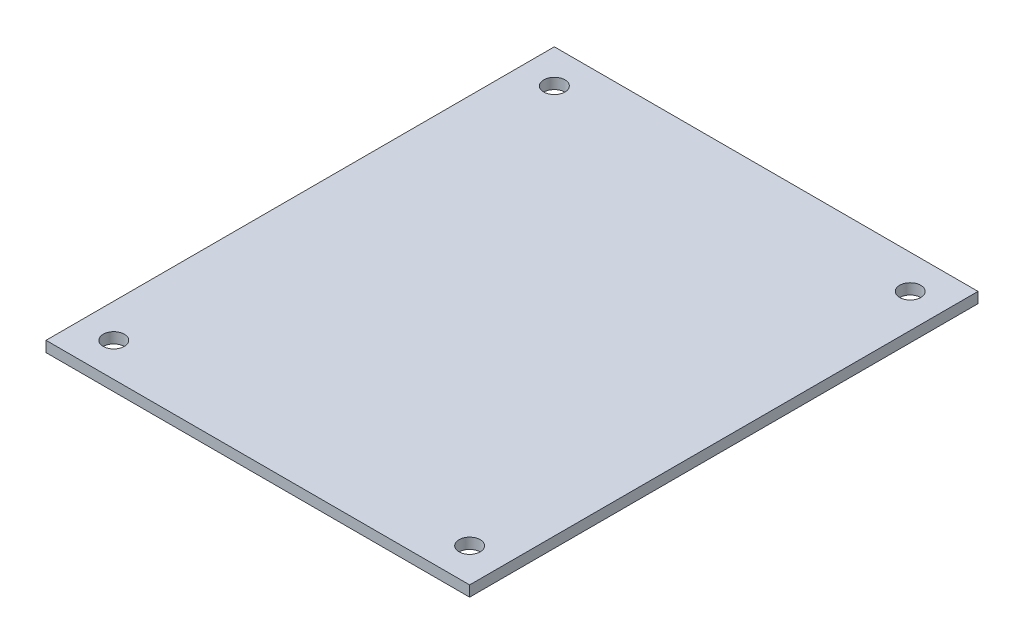
ISO-10303-21;
HEADER;
FILE_DESCRIPTION(('STEP AP214'),'2;1');
FILE_NAME('part.step','',(''),(''),'','','');
FILE_SCHEMA(('AUTOMOTIVE_DESIGN { 1 0 10303 214 1 1 1 1 }'));
ENDSEC;
DATA;
#1=APPLICATION_CONTEXT('core data for automotive mechanical design processes');
#2=APPLICATION_PROTOCOL_DEFINITION('international standard','automotive_design',2000,#1);
#3=PRODUCT_CONTEXT('',#1,'mechanical');
#4=PRODUCT('Part','Part','',(#3));
#5=PRODUCT_RELATED_PRODUCT_CATEGORY('part','',(#4));
#6=PRODUCT_DEFINITION_FORMATION('','',#4);
#7=PRODUCT_DEFINITION_CONTEXT('part definition',#1,'design');
#8=PRODUCT_DEFINITION('design','',#6,#7);
#9=PRODUCT_DEFINITION_SHAPE('','',#8);
#10=(LENGTH_UNIT() NAMED_UNIT(*) SI_UNIT(.MILLI.,.METRE.));
#11=(NAMED_UNIT(*) PLANE_ANGLE_UNIT() SI_UNIT($,.RADIAN.));
#12=(NAMED_UNIT(*) SI_UNIT($,.STERADIAN.) SOLID_ANGLE_UNIT());
#13=UNCERTAINTY_MEASURE_WITH_UNIT(LENGTH_MEASURE(1.E-05),#10,'distance_accuracy_value','');
#14=(GEOMETRIC_REPRESENTATION_CONTEXT(3) GLOBAL_UNCERTAINTY_ASSIGNED_CONTEXT((#13)) GLOBAL_UNIT_ASSIGNED_CONTEXT((#10,
#11,#12)) REPRESENTATION_CONTEXT('',''));
#15=CARTESIAN_POINT('',(0.,0.,0.));
#16=DIRECTION('',(0.,0.,1.));
#17=DIRECTION('',(1.,0.,0.));
#18=AXIS2_PLACEMENT_3D('',#15,#16,#17);
#19=CARTESIAN_POINT('',(0.,1.6,0.));
#20=DIRECTION('',(0.,-1.,0.));
#21=DIRECTION('',(0.,0.,-1.));
#22=AXIS2_PLACEMENT_3D('',#19,#20,#21);
#23=PLANE('',#22);
#24=CARTESIAN_POINT('',(58.42,1.6,-71.12));
#25=DIRECTION('',(0.,1.,0.));
#26=DIRECTION('',(0.,0.,1.));
#27=AXIS2_PLACEMENT_3D('',#24,#25,#26);
#28=CIRCLE('',#27,1.5875);
#29=CARTESIAN_POINT('',(58.42,1.6,-69.5325));
#30=VERTEX_POINT('',#29);
#31=EDGE_CURVE('E123',#30,#30,#28,.T.);
#32=ORIENTED_EDGE('',*,*,#31,.F.);
#33=EDGE_LOOP('',(#32));
#34=FACE_BOUND('',#33,.T.);
#35=CARTESIAN_POINT('',(5.08,1.6,-5.08));
#36=DIRECTION('',(0.,1.,0.));
#37=DIRECTION('',(0.,0.,1.));
#38=AXIS2_PLACEMENT_3D('',#35,#36,#37);
#39=CIRCLE('',#38,1.5875);
#40=CARTESIAN_POINT('',(5.08,1.6,-3.4925));
#41=VERTEX_POINT('',#40);
#42=EDGE_CURVE('E102',#41,#41,#39,.T.);
#43=ORIENTED_EDGE('',*,*,#42,.F.);
#44=EDGE_LOOP('',(#43));
#45=FACE_BOUND('',#44,.T.);
#46=DIRECTION('',(0.,0.,1.));
#47=VECTOR('',#46,1.);
#48=CARTESIAN_POINT('',(0.,1.6,0.));
#49=LINE('',#48,#47);
#50=CARTESIAN_POINT('',(0.,1.6,-76.2));
#51=VERTEX_POINT('',#50);
#52=CARTESIAN_POINT('',(0.,1.6,0.));
#53=VERTEX_POINT('',#52);
#54=EDGE_CURVE('E87',#51,#53,#49,.T.);
#55=ORIENTED_EDGE('',*,*,#54,.T.);
#56=DIRECTION('',(1.,0.,0.));
#57=VECTOR('',#56,1.);
#58=CARTESIAN_POINT('',(0.,1.6,0.));
#59=LINE('',#58,#57);
#60=CARTESIAN_POINT('',(63.5,1.6,0.));
#61=VERTEX_POINT('',#60);
#62=EDGE_CURVE('E82',#53,#61,#59,.T.);
#63=ORIENTED_EDGE('',*,*,#62,.T.);
#64=DIRECTION('',(0.,0.,-1.));
#65=VECTOR('',#64,1.);
#66=CARTESIAN_POINT('',(63.5,1.6,0.));
#67=LINE('',#66,#65);
#68=CARTESIAN_POINT('',(63.5,1.6,-76.2));
#69=VERTEX_POINT('',#68);
#70=EDGE_CURVE('E85',#61,#69,#67,.T.);
#71=ORIENTED_EDGE('',*,*,#70,.T.);
#72=DIRECTION('',(-1.,0.,0.));
#73=VECTOR('',#72,1.);
#74=CARTESIAN_POINT('',(0.,1.6,-76.2));
#75=LINE('',#74,#73);
#76=EDGE_CURVE('E52',#69,#51,#75,.T.);
#77=ORIENTED_EDGE('',*,*,#76,.T.);
#78=EDGE_LOOP('',(#55,#63,#71,#77));
#79=FACE_BOUND('',#78,.T.);
#80=CARTESIAN_POINT('',(58.42,1.6,-5.08));
#81=DIRECTION('',(0.,1.,0.));
#82=DIRECTION('',(0.,0.,1.));
#83=AXIS2_PLACEMENT_3D('',#80,#81,#82);
#84=CIRCLE('',#83,1.5875);
#85=CARTESIAN_POINT('',(58.42,1.6,-3.4925));
#86=VERTEX_POINT('',#85);
#87=EDGE_CURVE('E117',#86,#86,#84,.T.);
#88=ORIENTED_EDGE('',*,*,#87,.F.);
#89=EDGE_LOOP('',(#88));
#90=FACE_BOUND('',#89,.T.);
#91=CARTESIAN_POINT('',(5.08,1.6,-71.12));
#92=DIRECTION('',(0.,1.,0.));
#93=DIRECTION('',(0.,0.,1.));
#94=AXIS2_PLACEMENT_3D('',#91,#92,#93);
#95=CIRCLE('',#94,1.5875);
#96=CARTESIAN_POINT('',(5.08,1.6,-69.5325));
#97=VERTEX_POINT('',#96);
#98=EDGE_CURVE('E129',#97,#97,#95,.T.);
#99=ORIENTED_EDGE('',*,*,#98,.F.);
#100=EDGE_LOOP('',(#99));
#101=FACE_BOUND('',#100,.T.);
#102=ADVANCED_FACE('F35',(#34,#45,#79,#90,#101),#23,.F.);
#103=CARTESIAN_POINT('',(0.,0.,0.));
#104=DIRECTION('',(0.,-1.,0.));
#105=DIRECTION('',(0.,0.,-1.));
#106=AXIS2_PLACEMENT_3D('',#103,#104,#105);
#107=PLANE('',#106);
#108=CARTESIAN_POINT('',(58.42,0.,-71.12));
#109=DIRECTION('',(0.,1.,0.));
#110=DIRECTION('',(0.,0.,1.));
#111=AXIS2_PLACEMENT_3D('',#108,#109,#110);
#112=CIRCLE('',#111,1.5875);
#113=CARTESIAN_POINT('',(58.42,0.,-69.5325));
#114=VERTEX_POINT('',#113);
#115=EDGE_CURVE('E126',#114,#114,#112,.T.);
#116=ORIENTED_EDGE('',*,*,#115,.T.);
#117=EDGE_LOOP('',(#116));
#118=FACE_BOUND('',#117,.T.);
#119=CARTESIAN_POINT('',(5.08,0.,-5.08));
#120=DIRECTION('',(0.,1.,0.));
#121=DIRECTION('',(0.,0.,1.));
#122=AXIS2_PLACEMENT_3D('',#119,#120,#121);
#123=CIRCLE('',#122,1.5875);
#124=CARTESIAN_POINT('',(5.08,0.,-3.4925));
#125=VERTEX_POINT('',#124);
#126=EDGE_CURVE('E114',#125,#125,#123,.T.);
#127=ORIENTED_EDGE('',*,*,#126,.T.);
#128=EDGE_LOOP('',(#127));
#129=FACE_BOUND('',#128,.T.);
#130=DIRECTION('',(0.,0.,1.));
#131=VECTOR('',#130,1.);
#132=CARTESIAN_POINT('',(0.,0.,0.));
#133=LINE('',#132,#131);
#134=CARTESIAN_POINT('',(0.,0.,-76.2));
#135=VERTEX_POINT('',#134);
#136=CARTESIAN_POINT('',(0.,0.,0.));
#137=VERTEX_POINT('',#136);
#138=EDGE_CURVE('E99',#135,#137,#133,.T.);
#139=ORIENTED_EDGE('',*,*,#138,.F.);
#140=DIRECTION('',(-1.,0.,0.));
#141=VECTOR('',#140,1.);
#142=CARTESIAN_POINT('',(0.,0.,-76.2));
#143=LINE('',#142,#141);
#144=CARTESIAN_POINT('',(63.5,0.,-76.2));
#145=VERTEX_POINT('',#144);
#146=EDGE_CURVE('E75',#145,#135,#143,.T.);
#147=ORIENTED_EDGE('',*,*,#146,.F.);
#148=DIRECTION('',(0.,0.,-1.));
#149=VECTOR('',#148,1.);
#150=CARTESIAN_POINT('',(63.5,0.,0.));
#151=LINE('',#150,#149);
#152=CARTESIAN_POINT('',(63.5,0.,0.));
#153=VERTEX_POINT('',#152);
#154=EDGE_CURVE('E69',#153,#145,#151,.T.);
#155=ORIENTED_EDGE('',*,*,#154,.F.);
#156=DIRECTION('',(1.,0.,0.));
#157=VECTOR('',#156,1.);
#158=CARTESIAN_POINT('',(0.,0.,0.));
#159=LINE('',#158,#157);
#160=EDGE_CURVE('E91',#137,#153,#159,.T.);
#161=ORIENTED_EDGE('',*,*,#160,.F.);
#162=EDGE_LOOP('',(#139,#147,#155,#161));
#163=FACE_BOUND('',#162,.T.);
#164=CARTESIAN_POINT('',(58.42,0.,-5.08));
#165=DIRECTION('',(0.,1.,0.));
#166=DIRECTION('',(0.,0.,1.));
#167=AXIS2_PLACEMENT_3D('',#164,#165,#166);
#168=CIRCLE('',#167,1.5875);
#169=CARTESIAN_POINT('',(58.42,0.,-3.4925));
#170=VERTEX_POINT('',#169);
#171=EDGE_CURVE('E120',#170,#170,#168,.T.);
#172=ORIENTED_EDGE('',*,*,#171,.T.);
#173=EDGE_LOOP('',(#172));
#174=FACE_BOUND('',#173,.T.);
#175=CARTESIAN_POINT('',(5.08,0.,-71.12));
#176=DIRECTION('',(0.,1.,0.));
#177=DIRECTION('',(0.,0.,1.));
#178=AXIS2_PLACEMENT_3D('',#175,#176,#177);
#179=CIRCLE('',#178,1.5875);
#180=CARTESIAN_POINT('',(5.08,0.,-69.5325));
#181=VERTEX_POINT('',#180);
#182=EDGE_CURVE('E132',#181,#181,#179,.T.);
#183=ORIENTED_EDGE('',*,*,#182,.T.);
#184=EDGE_LOOP('',(#183));
#185=FACE_BOUND('',#184,.T.);
#186=ADVANCED_FACE('F110',(#118,#129,#163,#174,#185),#107,.T.);
#187=CARTESIAN_POINT('',(0.,1.6,0.));
#188=DIRECTION('',(1.,0.,0.));
#189=DIRECTION('',(0.,0.,-1.));
#190=AXIS2_PLACEMENT_3D('',#187,#188,#189);
#191=PLANE('',#190);
#192=ORIENTED_EDGE('',*,*,#138,.T.);
#193=DIRECTION('',(0.,-1.,0.));
#194=VECTOR('',#193,1.);
#195=CARTESIAN_POINT('',(0.,1.6,0.));
#196=LINE('',#195,#194);
#197=EDGE_CURVE('E11',#53,#137,#196,.T.);
#198=ORIENTED_EDGE('',*,*,#197,.F.);
#199=ORIENTED_EDGE('',*,*,#54,.F.);
#200=DIRECTION('',(0.,-1.,0.));
#201=VECTOR('',#200,1.);
#202=CARTESIAN_POINT('',(0.,1.6,-76.2));
#203=LINE('',#202,#201);
#204=EDGE_CURVE('E95',#51,#135,#203,.T.);
#205=ORIENTED_EDGE('',*,*,#204,.T.);
#206=EDGE_LOOP('',(#192,#198,#199,#205));
#207=FACE_BOUND('',#206,.T.);
#208=ADVANCED_FACE('F37',(#207),#191,.F.);
#209=CARTESIAN_POINT('',(0.,1.6,0.));
#210=DIRECTION('',(0.,0.,-1.));
#211=DIRECTION('',(-1.,0.,0.));
#212=AXIS2_PLACEMENT_3D('',#209,#210,#211);
#213=PLANE('',#212);
#214=ORIENTED_EDGE('',*,*,#160,.T.);
#215=DIRECTION('',(0.,-1.,0.));
#216=VECTOR('',#215,1.);
#217=CARTESIAN_POINT('',(63.5,1.6,0.));
#218=LINE('',#217,#216);
#219=EDGE_CURVE('E44',#61,#153,#218,.T.);
#220=ORIENTED_EDGE('',*,*,#219,.F.);
#221=ORIENTED_EDGE('',*,*,#62,.F.);
#222=ORIENTED_EDGE('',*,*,#197,.T.);
#223=EDGE_LOOP('',(#214,#220,#221,#222));
#224=FACE_BOUND('',#223,.T.);
#225=ADVANCED_FACE('F90',(#224),#213,.F.);
#226=CARTESIAN_POINT('',(63.5,1.6,0.));
#227=DIRECTION('',(-1.,0.,0.));
#228=DIRECTION('',(0.,0.,1.));
#229=AXIS2_PLACEMENT_3D('',#226,#227,#228);
#230=PLANE('',#229);
#231=ORIENTED_EDGE('',*,*,#154,.T.);
#232=DIRECTION('',(0.,-1.,0.));
#233=VECTOR('',#232,1.);
#234=CARTESIAN_POINT('',(63.5,1.6,-76.2));
#235=LINE('',#234,#233);
#236=EDGE_CURVE('E92',#69,#145,#235,.T.);
#237=ORIENTED_EDGE('',*,*,#236,.F.);
#238=ORIENTED_EDGE('',*,*,#70,.F.);
#239=ORIENTED_EDGE('',*,*,#219,.T.);
#240=EDGE_LOOP('',(#231,#237,#238,#239));
#241=FACE_BOUND('',#240,.T.);
#242=ADVANCED_FACE('F93',(#241),#230,.F.);
#243=CARTESIAN_POINT('',(0.,1.6,-76.2));
#244=DIRECTION('',(0.,0.,1.));
#245=DIRECTION('',(1.,0.,0.));
#246=AXIS2_PLACEMENT_3D('',#243,#244,#245);
#247=PLANE('',#246);
#248=ORIENTED_EDGE('',*,*,#146,.T.);
#249=ORIENTED_EDGE('',*,*,#204,.F.);
#250=ORIENTED_EDGE('',*,*,#76,.F.);
#251=ORIENTED_EDGE('',*,*,#236,.T.);
#252=EDGE_LOOP('',(#248,#249,#250,#251));
#253=FACE_BOUND('',#252,.T.);
#254=ADVANCED_FACE('F107',(#253),#247,.F.);
#255=CARTESIAN_POINT('',(5.08,1.6,-5.08));
#256=DIRECTION('',(0.,-1.,0.));
#257=DIRECTION('',(0.,0.,-1.));
#258=AXIS2_PLACEMENT_3D('',#255,#256,#257);
#259=CYLINDRICAL_SURFACE('',#258,1.5875);
#260=ORIENTED_EDGE('',*,*,#42,.T.);
#261=EDGE_LOOP('',(#260));
#262=FACE_BOUND('',#261,.T.);
#263=ORIENTED_EDGE('',*,*,#126,.F.);
#264=EDGE_LOOP('',(#263));
#265=FACE_BOUND('',#264,.T.);
#266=ADVANCED_FACE('F152',(#262,#265),#259,.F.);
#267=CARTESIAN_POINT('',(58.42,1.6,-5.08));
#268=DIRECTION('',(0.,-1.,0.));
#269=DIRECTION('',(0.,0.,-1.));
#270=AXIS2_PLACEMENT_3D('',#267,#268,#269);
#271=CYLINDRICAL_SURFACE('',#270,1.5875);
#272=ORIENTED_EDGE('',*,*,#87,.T.);
#273=EDGE_LOOP('',(#272));
#274=FACE_BOUND('',#273,.T.);
#275=ORIENTED_EDGE('',*,*,#171,.F.);
#276=EDGE_LOOP('',(#275));
#277=FACE_BOUND('',#276,.T.);
#278=ADVANCED_FACE('F200',(#274,#277),#271,.F.);
#279=CARTESIAN_POINT('',(58.42,1.6,-71.12));
#280=DIRECTION('',(0.,-1.,0.));
#281=DIRECTION('',(0.,0.,-1.));
#282=AXIS2_PLACEMENT_3D('',#279,#280,#281);
#283=CYLINDRICAL_SURFACE('',#282,1.5875);
#284=ORIENTED_EDGE('',*,*,#31,.T.);
#285=EDGE_LOOP('',(#284));
#286=FACE_BOUND('',#285,.T.);
#287=ORIENTED_EDGE('',*,*,#115,.F.);
#288=EDGE_LOOP('',(#287));
#289=FACE_BOUND('',#288,.T.);
#290=ADVANCED_FACE('F208',(#286,#289),#283,.F.);
#291=CARTESIAN_POINT('',(5.08,1.6,-71.12));
#292=DIRECTION('',(0.,-1.,0.));
#293=DIRECTION('',(0.,0.,-1.));
#294=AXIS2_PLACEMENT_3D('',#291,#292,#293);
#295=CYLINDRICAL_SURFACE('',#294,1.5875);
#296=ORIENTED_EDGE('',*,*,#98,.T.);
#297=EDGE_LOOP('',(#296));
#298=FACE_BOUND('',#297,.T.);
#299=ORIENTED_EDGE('',*,*,#182,.F.);
#300=EDGE_LOOP('',(#299));
#301=FACE_BOUND('',#300,.T.);
#302=ADVANCED_FACE('F138',(#298,#301),#295,.F.);
#303=CLOSED_SHELL('',(#102,#186,#208,#225,#242,#254,#266,#278,#290,#302));
#304=MANIFOLD_SOLID_BREP('B2',#303);
#305=ADVANCED_BREP_SHAPE_REPRESENTATION('',(#18,#304),#14);
#306=SHAPE_DEFINITION_REPRESENTATION(#9,#305);
ENDSEC;
END-ISO-10303-21;
